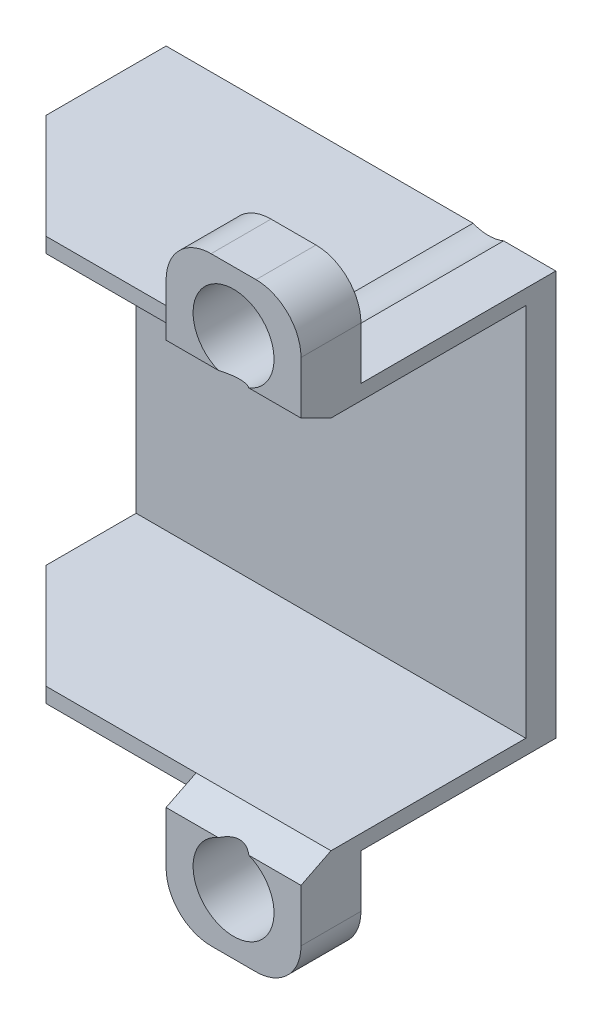
ISO-10303-21;
HEADER;
FILE_DESCRIPTION(('STEP AP214'),'2;1');
FILE_NAME('part.step','',(''),(''),'','','');
FILE_SCHEMA(('AUTOMOTIVE_DESIGN { 1 0 10303 214 1 1 1 1 }'));
ENDSEC;
DATA;
#1=APPLICATION_CONTEXT('core data for automotive mechanical design processes');
#2=APPLICATION_PROTOCOL_DEFINITION('international standard','automotive_design',2000,#1);
#3=PRODUCT_CONTEXT('',#1,'mechanical');
#4=PRODUCT('Part','Part','',(#3));
#5=PRODUCT_RELATED_PRODUCT_CATEGORY('part','',(#4));
#6=PRODUCT_DEFINITION_FORMATION('','',#4);
#7=PRODUCT_DEFINITION_CONTEXT('part definition',#1,'design');
#8=PRODUCT_DEFINITION('design','',#6,#7);
#9=PRODUCT_DEFINITION_SHAPE('','',#8);
#10=(LENGTH_UNIT() NAMED_UNIT(*) SI_UNIT(.MILLI.,.METRE.));
#11=(NAMED_UNIT(*) PLANE_ANGLE_UNIT() SI_UNIT($,.RADIAN.));
#12=(NAMED_UNIT(*) SI_UNIT($,.STERADIAN.) SOLID_ANGLE_UNIT());
#13=UNCERTAINTY_MEASURE_WITH_UNIT(LENGTH_MEASURE(1.E-05),#10,'distance_accuracy_value','');
#14=(GEOMETRIC_REPRESENTATION_CONTEXT(3) GLOBAL_UNCERTAINTY_ASSIGNED_CONTEXT((#13)) GLOBAL_UNIT_ASSIGNED_CONTEXT((#10,
#11,#12)) REPRESENTATION_CONTEXT('',''));
#15=CARTESIAN_POINT('',(0.,0.,0.));
#16=DIRECTION('',(0.,0.,1.));
#17=DIRECTION('',(1.,0.,0.));
#18=AXIS2_PLACEMENT_3D('',#15,#16,#17);
#19=CARTESIAN_POINT('',(-39.39977171448,-16.3800685313799,2.));
#20=DIRECTION('',(0.,1.,0.));
#21=DIRECTION('',(0.,0.,1.));
#22=AXIS2_PLACEMENT_3D('',#19,#20,#21);
#23=PLANE('',#22);
#24=DIRECTION('',(1.,0.,0.));
#25=VECTOR('',#24,1.);
#26=CARTESIAN_POINT('',(-39.39977171448,-16.3800685313799,15.));
#27=LINE('',#26,#25);
#28=CARTESIAN_POINT('',(-32.39977171448,-16.3800685313799,15.));
#29=VERTEX_POINT('',#28);
#30=CARTESIAN_POINT('',(-22.39977171448,-16.3800685313799,15.));
#31=VERTEX_POINT('',#30);
#32=EDGE_CURVE('E358',#29,#31,#27,.T.);
#33=ORIENTED_EDGE('',*,*,#32,.F.);
#34=DIRECTION('',(0.707106781186547,0.,0.707106781186547));
#35=VECTOR('',#34,1.);
#36=CARTESIAN_POINT('',(-39.39977171448,-16.3800685313799,8.));
#37=LINE('',#36,#35);
#38=CARTESIAN_POINT('',(-39.39977171448,-16.3800685313799,8.));
#39=VERTEX_POINT('',#38);
#40=EDGE_CURVE('E231',#39,#29,#37,.T.);
#41=ORIENTED_EDGE('',*,*,#40,.F.);
#42=DIRECTION('',(0.,0.,-1.));
#43=VECTOR('',#42,1.);
#44=CARTESIAN_POINT('',(-39.39977171448,-16.3800685313799,2.));
#45=LINE('',#44,#43);
#46=CARTESIAN_POINT('',(-39.39977171448,-16.3800685313799,0.));
#47=VERTEX_POINT('',#46);
#48=EDGE_CURVE('E261',#39,#47,#45,.T.);
#49=ORIENTED_EDGE('',*,*,#48,.T.);
#50=DIRECTION('',(1.,0.,0.));
#51=VECTOR('',#50,1.);
#52=CARTESIAN_POINT('',(-39.39977171448,-16.3800685313799,0.));
#53=LINE('',#52,#51);
#54=CARTESIAN_POINT('',(-18.9195756171986,-16.3800685313799,0.));
#55=VERTEX_POINT('',#54);
#56=EDGE_CURVE('E386',#47,#55,#53,.T.);
#57=ORIENTED_EDGE('',*,*,#56,.T.);
#58=DIRECTION('',(0.,0.,1.));
#59=VECTOR('',#58,1.);
#60=CARTESIAN_POINT('',(-18.9195756171986,-16.3800685313799,0.));
#61=LINE('',#60,#59);
#62=CARTESIAN_POINT('',(-18.9195756171986,-16.3800685313799,13.));
#63=VERTEX_POINT('',#62);
#64=EDGE_CURVE('E424',#55,#63,#61,.T.);
#65=ORIENTED_EDGE('',*,*,#64,.T.);
#66=DIRECTION('',(1.,0.,0.));
#67=VECTOR('',#66,1.);
#68=CARTESIAN_POINT('',(-22.39977171448,-16.3800685313799,13.));
#69=LINE('',#68,#67);
#70=CARTESIAN_POINT('',(-22.39977171448,-16.3800685313799,13.));
#71=VERTEX_POINT('',#70);
#72=EDGE_CURVE('E351',#71,#63,#69,.T.);
#73=ORIENTED_EDGE('',*,*,#72,.F.);
#74=DIRECTION('',(0.,0.,1.));
#75=VECTOR('',#74,1.);
#76=CARTESIAN_POINT('',(-22.39977171448,-16.3800685313799,15.));
#77=LINE('',#76,#75);
#78=EDGE_CURVE('E333',#71,#31,#77,.T.);
#79=ORIENTED_EDGE('',*,*,#78,.T.);
#80=EDGE_LOOP('',(#33,#41,#49,#57,#65,#73,#79));
#81=FACE_BOUND('',#80,.T.);
#82=ADVANCED_FACE('F33',(#81),#23,.F.);
#83=CARTESIAN_POINT('',(-39.39977171448,10.6199314686201,2.));
#84=DIRECTION('',(0.,-1.,0.));
#85=DIRECTION('',(0.,0.,-1.));
#86=AXIS2_PLACEMENT_3D('',#83,#84,#85);
#87=PLANE('',#86);
#88=DIRECTION('',(-1.,0.,0.));
#89=VECTOR('',#88,1.);
#90=CARTESIAN_POINT('',(-39.39977171448,10.6199314686201,0.));
#91=LINE('',#90,#89);
#92=CARTESIAN_POINT('',(-13.39977171448,10.6199314686201,0.));
#93=VERTEX_POINT('',#92);
#94=CARTESIAN_POINT('',(-16.8799678117614,10.6199314686201,0.));
#95=VERTEX_POINT('',#94);
#96=EDGE_CURVE('E256',#93,#95,#91,.T.);
#97=ORIENTED_EDGE('',*,*,#96,.T.);
#98=DIRECTION('',(0.,0.,1.));
#99=VECTOR('',#98,1.);
#100=CARTESIAN_POINT('',(-16.8799678117614,10.6199314686201,0.));
#101=LINE('',#100,#99);
#102=CARTESIAN_POINT('',(-16.8799678117614,10.6199314686201,13.));
#103=VERTEX_POINT('',#102);
#104=EDGE_CURVE('E398',#95,#103,#101,.T.);
#105=ORIENTED_EDGE('',*,*,#104,.T.);
#106=DIRECTION('',(1.,0.,0.));
#107=VECTOR('',#106,1.);
#108=CARTESIAN_POINT('',(-22.39977171448,10.6199314686201,13.));
#109=LINE('',#108,#107);
#110=CARTESIAN_POINT('',(-13.39977171448,10.6199314686201,13.));
#111=VERTEX_POINT('',#110);
#112=EDGE_CURVE('E441',#103,#111,#109,.T.);
#113=ORIENTED_EDGE('',*,*,#112,.T.);
#114=DIRECTION('',(0.,0.,-1.));
#115=VECTOR('',#114,1.);
#116=CARTESIAN_POINT('',(-13.39977171448,10.6199314686201,2.));
#117=LINE('',#116,#115);
#118=EDGE_CURVE('E248',#111,#93,#117,.T.);
#119=ORIENTED_EDGE('',*,*,#118,.T.);
#120=EDGE_LOOP('',(#97,#105,#113,#119));
#121=FACE_BOUND('',#120,.T.);
#122=ADVANCED_FACE('F397',(#121),#87,.F.);
#123=CARTESIAN_POINT('',(0.,0.,15.));
#124=DIRECTION('',(0.,0.,-1.));
#125=DIRECTION('',(-1.,0.,0.));
#126=AXIS2_PLACEMENT_3D('',#123,#124,#125);
#127=PLANE('',#126);
#128=DIRECTION('',(-1.,0.,0.));
#129=VECTOR('',#128,1.);
#130=CARTESIAN_POINT('',(-39.39977171448,-15.3800685313799,15.));
#131=LINE('',#130,#129);
#132=CARTESIAN_POINT('',(-22.39977171448,-15.3800685313799,15.));
#133=VERTEX_POINT('',#132);
#134=CARTESIAN_POINT('',(-32.39977171448,-15.3800685313799,15.));
#135=VERTEX_POINT('',#134);
#136=EDGE_CURVE('E360',#133,#135,#131,.T.);
#137=ORIENTED_EDGE('',*,*,#136,.T.);
#138=DIRECTION('',(0.,-1.,0.));
#139=VECTOR('',#138,1.);
#140=CARTESIAN_POINT('',(-32.39977171448,10.6199314686201,15.));
#141=LINE('',#140,#139);
#142=EDGE_CURVE('E56',#135,#29,#141,.T.);
#143=ORIENTED_EDGE('',*,*,#142,.T.);
#144=ORIENTED_EDGE('',*,*,#32,.T.);
#145=DIRECTION('',(0.,1.,0.));
#146=VECTOR('',#145,1.);
#147=CARTESIAN_POINT('',(-22.39977171448,-15.3800685313799,15.));
#148=LINE('',#147,#146);
#149=EDGE_CURVE('E350',#31,#133,#148,.T.);
#150=ORIENTED_EDGE('',*,*,#149,.T.);
#151=EDGE_LOOP('',(#137,#143,#144,#150));
#152=FACE_BOUND('',#151,.T.);
#153=ADVANCED_FACE('F472',(#152),#127,.F.);
#154=CARTESIAN_POINT('',(0.,0.,2.));
#155=DIRECTION('',(0.,0.,1.));
#156=DIRECTION('',(1.,0.,0.));
#157=AXIS2_PLACEMENT_3D('',#154,#155,#156);
#158=PLANE('',#157);
#159=DIRECTION('',(0.,-1.,0.));
#160=VECTOR('',#159,1.);
#161=CARTESIAN_POINT('',(-39.39977171448,10.6199314686201,2.));
#162=LINE('',#161,#160);
#163=CARTESIAN_POINT('',(-39.39977171448,9.61993146862011,2.));
#164=VERTEX_POINT('',#163);
#165=CARTESIAN_POINT('',(-39.39977171448,-15.3800685313799,2.));
#166=VERTEX_POINT('',#165);
#167=EDGE_CURVE('E253',#164,#166,#162,.T.);
#168=ORIENTED_EDGE('',*,*,#167,.T.);
#169=DIRECTION('',(-1.,0.,0.));
#170=VECTOR('',#169,1.);
#171=CARTESIAN_POINT('',(-39.39977171448,-15.3800685313799,2.));
#172=LINE('',#171,#170);
#173=CARTESIAN_POINT('',(-13.39977171448,-15.3800685313799,2.));
#174=VERTEX_POINT('',#173);
#175=EDGE_CURVE('E353',#174,#166,#172,.T.);
#176=ORIENTED_EDGE('',*,*,#175,.F.);
#177=DIRECTION('',(0.,1.,0.));
#178=VECTOR('',#177,1.);
#179=CARTESIAN_POINT('',(-13.39977171448,10.6199314686201,2.));
#180=LINE('',#179,#178);
#181=CARTESIAN_POINT('',(-13.39977171448,9.61993146862011,2.));
#182=VERTEX_POINT('',#181);
#183=EDGE_CURVE('E249',#174,#182,#180,.T.);
#184=ORIENTED_EDGE('',*,*,#183,.T.);
#185=DIRECTION('',(1.,0.,0.));
#186=VECTOR('',#185,1.);
#187=CARTESIAN_POINT('',(-39.39977171448,9.61993146862011,2.));
#188=LINE('',#187,#186);
#189=EDGE_CURVE('E370',#164,#182,#188,.T.);
#190=ORIENTED_EDGE('',*,*,#189,.F.);
#191=EDGE_LOOP('',(#168,#176,#184,#190));
#192=FACE_BOUND('',#191,.T.);
#193=ADVANCED_FACE('F535',(#192),#158,.T.);
#194=CARTESIAN_POINT('',(-39.39977171448,10.6199314686201,2.));
#195=DIRECTION('',(1.,0.,0.));
#196=DIRECTION('',(0.,0.,-1.));
#197=AXIS2_PLACEMENT_3D('',#194,#195,#196);
#198=PLANE('',#197);
#199=ORIENTED_EDGE('',*,*,#48,.F.);
#200=DIRECTION('',(0.,-1.,0.));
#201=VECTOR('',#200,1.);
#202=CARTESIAN_POINT('',(-39.39977171448,10.6199314686201,8.));
#203=LINE('',#202,#201);
#204=CARTESIAN_POINT('',(-39.39977171448,-15.3800685313799,8.));
#205=VERTEX_POINT('',#204);
#206=EDGE_CURVE('E230',#205,#39,#203,.T.);
#207=ORIENTED_EDGE('',*,*,#206,.F.);
#208=DIRECTION('',(0.,0.,-1.));
#209=VECTOR('',#208,1.);
#210=CARTESIAN_POINT('',(-39.39977171448,-15.3800685313799,15.));
#211=LINE('',#210,#209);
#212=EDGE_CURVE('E364',#205,#166,#211,.T.);
#213=ORIENTED_EDGE('',*,*,#212,.T.);
#214=ORIENTED_EDGE('',*,*,#167,.F.);
#215=DIRECTION('',(0.,0.,-1.));
#216=VECTOR('',#215,1.);
#217=CARTESIAN_POINT('',(-39.39977171448,9.61993146862011,15.));
#218=LINE('',#217,#216);
#219=CARTESIAN_POINT('',(-39.39977171448,9.61993146862011,8.));
#220=VERTEX_POINT('',#219);
#221=EDGE_CURVE('E241',#220,#164,#218,.T.);
#222=ORIENTED_EDGE('',*,*,#221,.F.);
#223=CARTESIAN_POINT('',(-39.39977171448,10.6199314686201,8.));
#224=VERTEX_POINT('',#223);
#225=EDGE_CURVE('E224',#224,#220,#203,.T.);
#226=ORIENTED_EDGE('',*,*,#225,.F.);
#227=DIRECTION('',(0.,0.,-1.));
#228=VECTOR('',#227,1.);
#229=CARTESIAN_POINT('',(-39.39977171448,10.6199314686201,2.));
#230=LINE('',#229,#228);
#231=CARTESIAN_POINT('',(-39.39977171448,10.6199314686201,0.));
#232=VERTEX_POINT('',#231);
#233=EDGE_CURVE('E238',#224,#232,#230,.T.);
#234=ORIENTED_EDGE('',*,*,#233,.T.);
#235=DIRECTION('',(0.,-1.,0.));
#236=VECTOR('',#235,1.);
#237=CARTESIAN_POINT('',(-39.39977171448,10.6199314686201,0.));
#238=LINE('',#237,#236);
#239=EDGE_CURVE('E381',#232,#47,#238,.T.);
#240=ORIENTED_EDGE('',*,*,#239,.T.);
#241=EDGE_LOOP('',(#199,#207,#213,#214,#222,#226,#234,#240));
#242=FACE_BOUND('',#241,.T.);
#243=ADVANCED_FACE('F236',(#242),#198,.F.);
#244=CARTESIAN_POINT('',(-16.8799678117614,-16.3800685313799,13.));
#245=VERTEX_POINT('',#244);
#246=CARTESIAN_POINT('',(-13.39977171448,-16.3800685313799,13.));
#247=VERTEX_POINT('',#246);
#248=EDGE_CURVE('E354',#245,#247,#69,.T.);
#249=ORIENTED_EDGE('',*,*,#248,.F.);
#250=DIRECTION('',(0.,0.,1.));
#251=VECTOR('',#250,1.);
#252=CARTESIAN_POINT('',(-16.8799678117615,-16.3800685313799,0.));
#253=LINE('',#252,#251);
#254=CARTESIAN_POINT('',(-16.8799678117615,-16.3800685313799,0.));
#255=VERTEX_POINT('',#254);
#256=EDGE_CURVE('E421',#245,#255,#253,.F.);
#257=ORIENTED_EDGE('',*,*,#256,.T.);
#258=CARTESIAN_POINT('',(-13.39977171448,-16.3800685313799,0.));
#259=VERTEX_POINT('',#258);
#260=EDGE_CURVE('E385',#255,#259,#53,.T.);
#261=ORIENTED_EDGE('',*,*,#260,.T.);
#262=DIRECTION('',(0.,0.,-1.));
#263=VECTOR('',#262,1.);
#264=CARTESIAN_POINT('',(-13.39977171448,-16.3800685313799,2.));
#265=LINE('',#264,#263);
#266=EDGE_CURVE('E251',#247,#259,#265,.T.);
#267=ORIENTED_EDGE('',*,*,#266,.F.);
#268=EDGE_LOOP('',(#249,#257,#261,#267));
#269=FACE_BOUND('',#268,.T.);
#270=ADVANCED_FACE('F542',(#269),#23,.F.);
#271=CARTESIAN_POINT('',(-13.39977171448,10.6199314686201,2.));
#272=DIRECTION('',(-1.,0.,0.));
#273=DIRECTION('',(0.,-1.,0.));
#274=AXIS2_PLACEMENT_3D('',#271,#272,#273);
#275=PLANE('',#274);
#276=DIRECTION('',(0.,1.,0.));
#277=VECTOR('',#276,1.);
#278=CARTESIAN_POINT('',(-13.39977171448,10.6199314686201,13.));
#279=LINE('',#278,#277);
#280=CARTESIAN_POINT('',(-13.39977171448,14.1199314686201,13.));
#281=VERTEX_POINT('',#280);
#282=EDGE_CURVE('E427',#111,#281,#279,.T.);
#283=ORIENTED_EDGE('',*,*,#282,.T.);
#284=DIRECTION('',(0.,0.,1.));
#285=VECTOR('',#284,1.);
#286=CARTESIAN_POINT('',(-13.39977171448,14.1199314686201,17.));
#287=LINE('',#286,#285);
#288=CARTESIAN_POINT('',(-13.39977171448,14.1199314686201,17.));
#289=VERTEX_POINT('',#288);
#290=EDGE_CURVE('E285',#281,#289,#287,.T.);
#291=ORIENTED_EDGE('',*,*,#290,.T.);
#292=DIRECTION('',(0.,-1.,0.));
#293=VECTOR('',#292,1.);
#294=CARTESIAN_POINT('',(-13.39977171448,10.6199314686201,17.));
#295=LINE('',#294,#293);
#296=CARTESIAN_POINT('',(-13.39977171448,10.6199314686201,17.));
#297=VERTEX_POINT('',#296);
#298=EDGE_CURVE('E444',#289,#297,#295,.T.);
#299=ORIENTED_EDGE('',*,*,#298,.T.);
#300=DIRECTION('',(0.,-0.447213595499958,-0.894427190999916));
#301=VECTOR('',#300,1.);
#302=CARTESIAN_POINT('',(-13.39977171448,10.6199314686201,17.));
#303=LINE('',#302,#301);
#304=CARTESIAN_POINT('',(-13.39977171448,9.61993146862011,15.));
#305=VERTEX_POINT('',#304);
#306=EDGE_CURVE('E431',#297,#305,#303,.T.);
#307=ORIENTED_EDGE('',*,*,#306,.T.);
#308=DIRECTION('',(0.,0.,-1.));
#309=VECTOR('',#308,1.);
#310=CARTESIAN_POINT('',(-13.39977171448,9.61993146862011,15.));
#311=LINE('',#310,#309);
#312=EDGE_CURVE('E375',#305,#182,#311,.T.);
#313=ORIENTED_EDGE('',*,*,#312,.T.);
#314=ORIENTED_EDGE('',*,*,#183,.F.);
#315=DIRECTION('',(0.,0.,-1.));
#316=VECTOR('',#315,1.);
#317=CARTESIAN_POINT('',(-13.39977171448,-15.3800685313799,15.));
#318=LINE('',#317,#316);
#319=CARTESIAN_POINT('',(-13.39977171448,-15.3800685313799,15.));
#320=VERTEX_POINT('',#319);
#321=EDGE_CURVE('E368',#320,#174,#318,.T.);
#322=ORIENTED_EDGE('',*,*,#321,.F.);
#323=DIRECTION('',(0.,-0.447213595499959,0.894427190999916));
#324=VECTOR('',#323,1.);
#325=CARTESIAN_POINT('',(-13.39977171448,-16.3800685313799,17.));
#326=LINE('',#325,#324);
#327=CARTESIAN_POINT('',(-13.39977171448,-16.3800685313799,17.));
#328=VERTEX_POINT('',#327);
#329=EDGE_CURVE('E341',#320,#328,#326,.T.);
#330=ORIENTED_EDGE('',*,*,#329,.T.);
#331=DIRECTION('',(0.,-1.,0.));
#332=VECTOR('',#331,1.);
#333=CARTESIAN_POINT('',(-13.39977171448,-16.3800685313799,17.));
#334=LINE('',#333,#332);
#335=CARTESIAN_POINT('',(-13.39977171448,-19.8800685313799,17.));
#336=VERTEX_POINT('',#335);
#337=EDGE_CURVE('E344',#328,#336,#334,.T.);
#338=ORIENTED_EDGE('',*,*,#337,.T.);
#339=DIRECTION('',(0.,0.,-1.));
#340=VECTOR('',#339,1.);
#341=CARTESIAN_POINT('',(-13.39977171448,-19.8800685313799,13.));
#342=LINE('',#341,#340);
#343=CARTESIAN_POINT('',(-13.39977171448,-19.8800685313799,13.));
#344=VERTEX_POINT('',#343);
#345=EDGE_CURVE('E282',#336,#344,#342,.T.);
#346=ORIENTED_EDGE('',*,*,#345,.T.);
#347=DIRECTION('',(0.,1.,0.));
#348=VECTOR('',#347,1.);
#349=CARTESIAN_POINT('',(-13.39977171448,-16.3800685313799,13.));
#350=LINE('',#349,#348);
#351=EDGE_CURVE('E348',#344,#247,#350,.T.);
#352=ORIENTED_EDGE('',*,*,#351,.T.);
#353=ORIENTED_EDGE('',*,*,#266,.T.);
#354=DIRECTION('',(0.,1.,0.));
#355=VECTOR('',#354,1.);
#356=CARTESIAN_POINT('',(-13.39977171448,10.6199314686201,0.));
#357=LINE('',#356,#355);
#358=EDGE_CURVE('E388',#259,#93,#357,.T.);
#359=ORIENTED_EDGE('',*,*,#358,.T.);
#360=ORIENTED_EDGE('',*,*,#118,.F.);
#361=EDGE_LOOP('',(#283,#291,#299,#307,#313,#314,#322,#330,#338,#346,#352,#353,#359,#360));
#362=FACE_BOUND('',#361,.T.);
#363=ADVANCED_FACE('F529',(#362),#275,.F.);
#364=ORIENTED_EDGE('',*,*,#233,.F.);
#365=DIRECTION('',(0.707106781186547,0.,0.707106781186547));
#366=VECTOR('',#365,1.);
#367=CARTESIAN_POINT('',(-39.39977171448,10.6199314686201,8.));
#368=LINE('',#367,#366);
#369=CARTESIAN_POINT('',(-32.39977171448,10.6199314686201,15.));
#370=VERTEX_POINT('',#369);
#371=EDGE_CURVE('E221',#224,#370,#368,.T.);
#372=ORIENTED_EDGE('',*,*,#371,.T.);
#373=DIRECTION('',(-1.,0.,0.));
#374=VECTOR('',#373,1.);
#375=CARTESIAN_POINT('',(-39.39977171448,10.6199314686201,15.));
#376=LINE('',#375,#374);
#377=CARTESIAN_POINT('',(-22.39977171448,10.6199314686201,15.));
#378=VERTEX_POINT('',#377);
#379=EDGE_CURVE('E373',#378,#370,#376,.T.);
#380=ORIENTED_EDGE('',*,*,#379,.F.);
#381=DIRECTION('',(0.,0.,-1.));
#382=VECTOR('',#381,1.);
#383=CARTESIAN_POINT('',(-22.39977171448,10.6199314686201,15.));
#384=LINE('',#383,#382);
#385=CARTESIAN_POINT('',(-22.39977171448,10.6199314686201,13.));
#386=VERTEX_POINT('',#385);
#387=EDGE_CURVE('E430',#378,#386,#384,.T.);
#388=ORIENTED_EDGE('',*,*,#387,.T.);
#389=CARTESIAN_POINT('',(-18.9195756171986,10.6199314686201,13.));
#390=VERTEX_POINT('',#389);
#391=EDGE_CURVE('E460',#386,#390,#109,.T.);
#392=ORIENTED_EDGE('',*,*,#391,.T.);
#393=DIRECTION('',(0.,0.,1.));
#394=VECTOR('',#393,1.);
#395=CARTESIAN_POINT('',(-18.9195756171986,10.6199314686201,0.));
#396=LINE('',#395,#394);
#397=CARTESIAN_POINT('',(-18.9195756171986,10.6199314686201,0.));
#398=VERTEX_POINT('',#397);
#399=EDGE_CURVE('E414',#390,#398,#396,.F.);
#400=ORIENTED_EDGE('',*,*,#399,.T.);
#401=EDGE_CURVE('E246',#398,#232,#91,.T.);
#402=ORIENTED_EDGE('',*,*,#401,.T.);
#403=EDGE_LOOP('',(#364,#372,#380,#388,#392,#400,#402));
#404=FACE_BOUND('',#403,.T.);
#405=ADVANCED_FACE('F243',(#404),#87,.F.);
#406=CARTESIAN_POINT('',(0.,0.,0.));
#407=DIRECTION('',(0.,0.,1.));
#408=DIRECTION('',(1.,0.,0.));
#409=AXIS2_PLACEMENT_3D('',#406,#407,#408);
#410=PLANE('',#409);
#411=ORIENTED_EDGE('',*,*,#260,.F.);
#412=CARTESIAN_POINT('',(-17.89977171448,-18.8800685313799,0.));
#413=DIRECTION('',(0.,0.,1.));
#414=DIRECTION('',(1.,0.,0.));
#415=AXIS2_PLACEMENT_3D('',#412,#413,#414);
#416=CIRCLE('',#415,2.7);
#417=EDGE_CURVE('E409',#255,#55,#416,.T.);
#418=ORIENTED_EDGE('',*,*,#417,.T.);
#419=ORIENTED_EDGE('',*,*,#56,.F.);
#420=ORIENTED_EDGE('',*,*,#239,.F.);
#421=ORIENTED_EDGE('',*,*,#401,.F.);
#422=CARTESIAN_POINT('',(-17.89977171448,13.1199314686201,0.));
#423=DIRECTION('',(0.,0.,1.));
#424=DIRECTION('',(1.,0.,0.));
#425=AXIS2_PLACEMENT_3D('',#422,#423,#424);
#426=CIRCLE('',#425,2.7);
#427=EDGE_CURVE('E404',#398,#95,#426,.T.);
#428=ORIENTED_EDGE('',*,*,#427,.T.);
#429=ORIENTED_EDGE('',*,*,#96,.F.);
#430=ORIENTED_EDGE('',*,*,#358,.F.);
#431=EDGE_LOOP('',(#411,#418,#419,#420,#421,#428,#429,#430));
#432=FACE_BOUND('',#431,.T.);
#433=ADVANCED_FACE('F403',(#432),#410,.F.);
#434=CARTESIAN_POINT('',(-39.39977171448,9.61993146862011,15.));
#435=DIRECTION('',(0.,1.,0.));
#436=DIRECTION('',(0.,0.,1.));
#437=AXIS2_PLACEMENT_3D('',#434,#435,#436);
#438=PLANE('',#437);
#439=DIRECTION('',(1.,0.,0.));
#440=VECTOR('',#439,1.);
#441=CARTESIAN_POINT('',(-39.39977171448,9.61993146862011,15.));
#442=LINE('',#441,#440);
#443=CARTESIAN_POINT('',(-32.39977171448,9.61993146862011,15.));
#444=VERTEX_POINT('',#443);
#445=CARTESIAN_POINT('',(-22.39977171448,9.61993146862011,15.));
#446=VERTEX_POINT('',#445);
#447=EDGE_CURVE('E371',#444,#446,#442,.T.);
#448=ORIENTED_EDGE('',*,*,#447,.F.);
#449=DIRECTION('',(-0.707106781186548,0.,-0.707106781186548));
#450=VECTOR('',#449,1.);
#451=CARTESIAN_POINT('',(-35.89977171448,9.61993146862011,11.5));
#452=LINE('',#451,#450);
#453=EDGE_CURVE('E48',#444,#220,#452,.T.);
#454=ORIENTED_EDGE('',*,*,#453,.T.);
#455=ORIENTED_EDGE('',*,*,#221,.T.);
#456=ORIENTED_EDGE('',*,*,#189,.T.);
#457=ORIENTED_EDGE('',*,*,#312,.F.);
#458=DIRECTION('',(1.,0.,0.));
#459=VECTOR('',#458,1.);
#460=CARTESIAN_POINT('',(-22.39977171448,9.61993146862011,15.));
#461=LINE('',#460,#459);
#462=EDGE_CURVE('E345',#446,#305,#461,.T.);
#463=ORIENTED_EDGE('',*,*,#462,.F.);
#464=EDGE_LOOP('',(#448,#454,#455,#456,#457,#463));
#465=FACE_BOUND('',#464,.T.);
#466=ADVANCED_FACE('F493',(#465),#438,.F.);
#467=CARTESIAN_POINT('',(0.,0.,15.));
#468=DIRECTION('',(0.,0.,1.));
#469=DIRECTION('',(1.,0.,0.));
#470=AXIS2_PLACEMENT_3D('',#467,#468,#469);
#471=PLANE('',#470);
#472=EDGE_CURVE('E225',#370,#444,#141,.T.);
#473=ORIENTED_EDGE('',*,*,#472,.T.);
#474=ORIENTED_EDGE('',*,*,#447,.T.);
#475=DIRECTION('',(0.,1.,0.));
#476=VECTOR('',#475,1.);
#477=CARTESIAN_POINT('',(-22.39977171448,9.61993146862011,15.));
#478=LINE('',#477,#476);
#479=EDGE_CURVE('E428',#446,#378,#478,.T.);
#480=ORIENTED_EDGE('',*,*,#479,.T.);
#481=ORIENTED_EDGE('',*,*,#379,.T.);
#482=EDGE_LOOP('',(#473,#474,#480,#481));
#483=FACE_BOUND('',#482,.T.);
#484=ADVANCED_FACE('F490',(#483),#471,.T.);
#485=CARTESIAN_POINT('',(-39.39977171448,-15.3800685313799,15.));
#486=DIRECTION('',(0.,-1.,0.));
#487=DIRECTION('',(0.,0.,-1.));
#488=AXIS2_PLACEMENT_3D('',#485,#486,#487);
#489=PLANE('',#488);
#490=ORIENTED_EDGE('',*,*,#212,.F.);
#491=DIRECTION('',(0.707106781186548,0.,0.707106781186548));
#492=VECTOR('',#491,1.);
#493=CARTESIAN_POINT('',(-35.89977171448,-15.3800685313799,11.5));
#494=LINE('',#493,#492);
#495=EDGE_CURVE('E11',#205,#135,#494,.T.);
#496=ORIENTED_EDGE('',*,*,#495,.T.);
#497=ORIENTED_EDGE('',*,*,#136,.F.);
#498=EDGE_CURVE('E361',#320,#133,#131,.T.);
#499=ORIENTED_EDGE('',*,*,#498,.F.);
#500=ORIENTED_EDGE('',*,*,#321,.T.);
#501=ORIENTED_EDGE('',*,*,#175,.T.);
#502=EDGE_LOOP('',(#490,#496,#497,#499,#500,#501));
#503=FACE_BOUND('',#502,.T.);
#504=ADVANCED_FACE('F476',(#503),#489,.F.);
#505=CARTESIAN_POINT('',(-22.39977171448,-16.3800685313799,13.));
#506=DIRECTION('',(0.,0.,-1.));
#507=DIRECTION('',(-1.,0.,0.));
#508=AXIS2_PLACEMENT_3D('',#505,#506,#507);
#509=PLANE('',#508);
#510=DIRECTION('',(1.,0.,0.));
#511=VECTOR('',#510,1.);
#512=CARTESIAN_POINT('',(-22.39977171448,-22.8800685313799,13.));
#513=LINE('',#512,#511);
#514=CARTESIAN_POINT('',(-19.39977171448,-22.8800685313799,13.));
#515=VERTEX_POINT('',#514);
#516=CARTESIAN_POINT('',(-16.39977171448,-22.8800685313799,13.));
#517=VERTEX_POINT('',#516);
#518=EDGE_CURVE('E318',#515,#517,#513,.T.);
#519=ORIENTED_EDGE('',*,*,#518,.F.);
#520=CARTESIAN_POINT('',(-19.39977171448,-19.8800685313799,13.));
#521=DIRECTION('',(0.,0.,-1.));
#522=DIRECTION('',(-1.,0.,0.));
#523=AXIS2_PLACEMENT_3D('',#520,#521,#522);
#524=CIRCLE('',#523,3.);
#525=CARTESIAN_POINT('',(-22.39977171448,-19.8800685313799,13.));
#526=VERTEX_POINT('',#525);
#527=EDGE_CURVE('E295',#515,#526,#524,.T.);
#528=ORIENTED_EDGE('',*,*,#527,.T.);
#529=DIRECTION('',(0.,1.,0.));
#530=VECTOR('',#529,1.);
#531=CARTESIAN_POINT('',(-22.39977171448,-16.3800685313799,13.));
#532=LINE('',#531,#530);
#533=EDGE_CURVE('E326',#526,#71,#532,.T.);
#534=ORIENTED_EDGE('',*,*,#533,.T.);
#535=ORIENTED_EDGE('',*,*,#72,.T.);
#536=CARTESIAN_POINT('',(-17.89977171448,-18.8800685313799,13.));
#537=DIRECTION('',(0.,0.,-1.));
#538=DIRECTION('',(-1.,0.,0.));
#539=AXIS2_PLACEMENT_3D('',#536,#537,#538);
#540=CIRCLE('',#539,2.7);
#541=EDGE_CURVE('E419',#245,#63,#540,.T.);
#542=ORIENTED_EDGE('',*,*,#541,.F.);
#543=ORIENTED_EDGE('',*,*,#248,.T.);
#544=ORIENTED_EDGE('',*,*,#351,.F.);
#545=CARTESIAN_POINT('',(-16.39977171448,-19.8800685313799,13.));
#546=DIRECTION('',(0.,0.,-1.));
#547=DIRECTION('',(-1.,0.,0.));
#548=AXIS2_PLACEMENT_3D('',#545,#546,#547);
#549=CIRCLE('',#548,3.);
#550=EDGE_CURVE('E293',#344,#517,#549,.T.);
#551=ORIENTED_EDGE('',*,*,#550,.T.);
#552=EDGE_LOOP('',(#519,#528,#534,#535,#542,#543,#544,#551));
#553=FACE_BOUND('',#552,.T.);
#554=ADVANCED_FACE('F324',(#553),#509,.T.);
#555=CARTESIAN_POINT('',(-22.39977171448,-22.8800685313799,15.));
#556=DIRECTION('',(0.,-1.,0.));
#557=DIRECTION('',(0.,0.,-1.));
#558=AXIS2_PLACEMENT_3D('',#555,#556,#557);
#559=PLANE('',#558);
#560=DIRECTION('',(1.,0.,0.));
#561=VECTOR('',#560,1.);
#562=CARTESIAN_POINT('',(-22.39977171448,-22.8800685313799,17.));
#563=LINE('',#562,#561);
#564=CARTESIAN_POINT('',(-19.39977171448,-22.8800685313799,17.));
#565=VERTEX_POINT('',#564);
#566=CARTESIAN_POINT('',(-16.39977171448,-22.8800685313799,17.));
#567=VERTEX_POINT('',#566);
#568=EDGE_CURVE('E306',#565,#567,#563,.T.);
#569=ORIENTED_EDGE('',*,*,#568,.F.);
#570=DIRECTION('',(0.,0.,-1.));
#571=VECTOR('',#570,1.);
#572=CARTESIAN_POINT('',(-19.39977171448,-22.8800685313799,13.));
#573=LINE('',#572,#571);
#574=EDGE_CURVE('E290',#565,#515,#573,.T.);
#575=ORIENTED_EDGE('',*,*,#574,.T.);
#576=ORIENTED_EDGE('',*,*,#518,.T.);
#577=DIRECTION('',(0.,0.,-1.));
#578=VECTOR('',#577,1.);
#579=CARTESIAN_POINT('',(-16.39977171448,-22.8800685313799,17.));
#580=LINE('',#579,#578);
#581=EDGE_CURVE('E288',#517,#567,#580,.F.);
#582=ORIENTED_EDGE('',*,*,#581,.T.);
#583=EDGE_LOOP('',(#569,#575,#576,#582));
#584=FACE_BOUND('',#583,.T.);
#585=ADVANCED_FACE('F314',(#584),#559,.T.);
#586=CARTESIAN_POINT('',(-22.39977171448,-16.3800685313799,17.));
#587=DIRECTION('',(0.,0.,1.));
#588=DIRECTION('',(1.,0.,0.));
#589=AXIS2_PLACEMENT_3D('',#586,#587,#588);
#590=PLANE('',#589);
#591=DIRECTION('',(0.,-1.,0.));
#592=VECTOR('',#591,1.);
#593=CARTESIAN_POINT('',(-22.39977171448,-16.3800685313799,17.));
#594=LINE('',#593,#592);
#595=CARTESIAN_POINT('',(-22.39977171448,-16.3800685313799,17.));
#596=VERTEX_POINT('',#595);
#597=CARTESIAN_POINT('',(-22.39977171448,-19.8800685313799,17.));
#598=VERTEX_POINT('',#597);
#599=EDGE_CURVE('E309',#596,#598,#594,.T.);
#600=ORIENTED_EDGE('',*,*,#599,.T.);
#601=CARTESIAN_POINT('',(-19.39977171448,-19.8800685313799,17.));
#602=DIRECTION('',(0.,0.,1.));
#603=DIRECTION('',(1.,0.,0.));
#604=AXIS2_PLACEMENT_3D('',#601,#602,#603);
#605=CIRCLE('',#604,3.);
#606=EDGE_CURVE('E41',#598,#565,#605,.T.);
#607=ORIENTED_EDGE('',*,*,#606,.T.);
#608=ORIENTED_EDGE('',*,*,#568,.T.);
#609=CARTESIAN_POINT('',(-16.39977171448,-19.8800685313799,17.));
#610=DIRECTION('',(0.,0.,1.));
#611=DIRECTION('',(1.,0.,0.));
#612=AXIS2_PLACEMENT_3D('',#609,#610,#611);
#613=CIRCLE('',#612,3.);
#614=EDGE_CURVE('E299',#567,#336,#613,.T.);
#615=ORIENTED_EDGE('',*,*,#614,.T.);
#616=ORIENTED_EDGE('',*,*,#337,.F.);
#617=DIRECTION('',(1.,0.,0.));
#618=VECTOR('',#617,1.);
#619=CARTESIAN_POINT('',(-22.39977171448,-16.3800685313799,17.));
#620=LINE('',#619,#618);
#621=CARTESIAN_POINT('',(-16.8799678117614,-16.3800685313799,17.));
#622=VERTEX_POINT('',#621);
#623=EDGE_CURVE('E335',#622,#328,#620,.T.);
#624=ORIENTED_EDGE('',*,*,#623,.F.);
#625=CARTESIAN_POINT('',(-17.89977171448,-18.8800685313799,17.));
#626=DIRECTION('',(0.,0.,1.));
#627=DIRECTION('',(1.,0.,0.));
#628=AXIS2_PLACEMENT_3D('',#625,#626,#627);
#629=CIRCLE('',#628,2.7);
#630=CARTESIAN_POINT('',(-18.9195756171986,-16.3800685313799,17.));
#631=VERTEX_POINT('',#630);
#632=EDGE_CURVE('E406',#631,#622,#629,.T.);
#633=ORIENTED_EDGE('',*,*,#632,.F.);
#634=EDGE_CURVE('E319',#596,#631,#620,.T.);
#635=ORIENTED_EDGE('',*,*,#634,.F.);
#636=EDGE_LOOP('',(#600,#607,#608,#615,#616,#624,#633,#635));
#637=FACE_BOUND('',#636,.T.);
#638=ADVANCED_FACE('F305',(#637),#590,.T.);
#639=CARTESIAN_POINT('',(-22.39977171448,-16.3800685313799,17.));
#640=DIRECTION('',(0.,0.894427190999916,0.447213595499958));
#641=DIRECTION('',(0.,-0.447213595499959,0.894427190999916));
#642=AXIS2_PLACEMENT_3D('',#639,#640,#641);
#643=PLANE('',#642);
#644=CARTESIAN_POINT('',(-17.89977171448,-18.8800685313799,22.));
#645=DIRECTION('',(0.,0.894427190999916,0.447213595499958));
#646=DIRECTION('',(0.,-0.447213595499959,0.894427190999916));
#647=AXIS2_PLACEMENT_3D('',#644,#645,#646);
#648=ELLIPSE('',#647,6.03738353924943,2.7);
#649=EDGE_CURVE('E265',#622,#631,#648,.T.);
#650=ORIENTED_EDGE('',*,*,#649,.F.);
#651=ORIENTED_EDGE('',*,*,#623,.T.);
#652=ORIENTED_EDGE('',*,*,#329,.F.);
#653=ORIENTED_EDGE('',*,*,#498,.T.);
#654=DIRECTION('',(0.,-0.447213595499959,0.894427190999916));
#655=VECTOR('',#654,1.);
#656=CARTESIAN_POINT('',(-22.39977171448,-16.3800685313799,17.));
#657=LINE('',#656,#655);
#658=EDGE_CURVE('E337',#133,#596,#657,.T.);
#659=ORIENTED_EDGE('',*,*,#658,.T.);
#660=ORIENTED_EDGE('',*,*,#634,.T.);
#661=EDGE_LOOP('',(#650,#651,#652,#653,#659,#660));
#662=FACE_BOUND('',#661,.T.);
#663=ADVANCED_FACE('F467',(#662),#643,.T.);
#664=CARTESIAN_POINT('',(-22.39977171448,0.,0.));
#665=DIRECTION('',(1.,0.,0.));
#666=DIRECTION('',(0.,0.,-1.));
#667=AXIS2_PLACEMENT_3D('',#664,#665,#666);
#668=PLANE('',#667);
#669=ORIENTED_EDGE('',*,*,#533,.F.);
#670=DIRECTION('',(0.,0.,-1.));
#671=VECTOR('',#670,1.);
#672=CARTESIAN_POINT('',(-22.39977171448,-19.8800685313799,17.));
#673=LINE('',#672,#671);
#674=EDGE_CURVE('E297',#526,#598,#673,.F.);
#675=ORIENTED_EDGE('',*,*,#674,.T.);
#676=ORIENTED_EDGE('',*,*,#599,.F.);
#677=ORIENTED_EDGE('',*,*,#658,.F.);
#678=ORIENTED_EDGE('',*,*,#149,.F.);
#679=ORIENTED_EDGE('',*,*,#78,.F.);
#680=EDGE_LOOP('',(#669,#675,#676,#677,#678,#679));
#681=FACE_BOUND('',#680,.T.);
#682=ADVANCED_FACE('F330',(#681),#668,.F.);
#683=CARTESIAN_POINT('',(-22.39977171448,10.6199314686201,17.));
#684=DIRECTION('',(0.,-0.894427190999916,0.447213595499958));
#685=DIRECTION('',(0.,-0.447213595499958,-0.894427190999916));
#686=AXIS2_PLACEMENT_3D('',#683,#684,#685);
#687=PLANE('',#686);
#688=CARTESIAN_POINT('',(-17.89977171448,13.1199314686201,22.));
#689=DIRECTION('',(0.,-0.894427190999916,0.447213595499958));
#690=DIRECTION('',(0.,0.447213595499958,0.894427190999916));
#691=AXIS2_PLACEMENT_3D('',#688,#689,#690);
#692=ELLIPSE('',#691,6.03738353924943,2.7);
#693=CARTESIAN_POINT('',(-18.9195756171986,10.6199314686201,17.));
#694=VERTEX_POINT('',#693);
#695=CARTESIAN_POINT('',(-16.8799678117614,10.6199314686201,17.));
#696=VERTEX_POINT('',#695);
#697=EDGE_CURVE('E417',#694,#696,#692,.T.);
#698=ORIENTED_EDGE('',*,*,#697,.F.);
#699=DIRECTION('',(1.,0.,0.));
#700=VECTOR('',#699,1.);
#701=CARTESIAN_POINT('',(-22.39977171448,10.6199314686201,17.));
#702=LINE('',#701,#700);
#703=CARTESIAN_POINT('',(-22.39977171448,10.6199314686201,17.));
#704=VERTEX_POINT('',#703);
#705=EDGE_CURVE('E450',#704,#694,#702,.T.);
#706=ORIENTED_EDGE('',*,*,#705,.F.);
#707=DIRECTION('',(0.,-0.447213595499958,-0.894427190999916));
#708=VECTOR('',#707,1.);
#709=CARTESIAN_POINT('',(-22.39977171448,10.6199314686201,17.));
#710=LINE('',#709,#708);
#711=EDGE_CURVE('E438',#704,#446,#710,.T.);
#712=ORIENTED_EDGE('',*,*,#711,.T.);
#713=ORIENTED_EDGE('',*,*,#462,.T.);
#714=ORIENTED_EDGE('',*,*,#306,.F.);
#715=EDGE_CURVE('E453',#696,#297,#702,.T.);
#716=ORIENTED_EDGE('',*,*,#715,.F.);
#717=EDGE_LOOP('',(#698,#706,#712,#713,#714,#716));
#718=FACE_BOUND('',#717,.T.);
#719=ADVANCED_FACE('F505',(#718),#687,.T.);
#720=CARTESIAN_POINT('',(-22.39977171448,10.6199314686201,17.));
#721=DIRECTION('',(0.,0.,1.));
#722=DIRECTION('',(0.,-1.,0.));
#723=AXIS2_PLACEMENT_3D('',#720,#721,#722);
#724=PLANE('',#723);
#725=DIRECTION('',(1.,0.,0.));
#726=VECTOR('',#725,1.);
#727=CARTESIAN_POINT('',(-22.39977171448,17.1199314686201,17.));
#728=LINE('',#727,#726);
#729=CARTESIAN_POINT('',(-19.39977171448,17.1199314686201,17.));
#730=VERTEX_POINT('',#729);
#731=CARTESIAN_POINT('',(-16.39977171448,17.1199314686201,17.));
#732=VERTEX_POINT('',#731);
#733=EDGE_CURVE('E454',#730,#732,#728,.T.);
#734=ORIENTED_EDGE('',*,*,#733,.F.);
#735=CARTESIAN_POINT('',(-19.39977171448,14.1199314686201,17.));
#736=DIRECTION('',(0.,0.,1.));
#737=DIRECTION('',(0.,-1.,0.));
#738=AXIS2_PLACEMENT_3D('',#735,#736,#737);
#739=CIRCLE('',#738,3.);
#740=CARTESIAN_POINT('',(-22.39977171448,14.1199314686201,17.));
#741=VERTEX_POINT('',#740);
#742=EDGE_CURVE('E274',#730,#741,#739,.T.);
#743=ORIENTED_EDGE('',*,*,#742,.T.);
#744=DIRECTION('',(0.,-1.,0.));
#745=VECTOR('',#744,1.);
#746=CARTESIAN_POINT('',(-22.39977171448,10.6199314686201,17.));
#747=LINE('',#746,#745);
#748=EDGE_CURVE('E436',#741,#704,#747,.T.);
#749=ORIENTED_EDGE('',*,*,#748,.T.);
#750=ORIENTED_EDGE('',*,*,#705,.T.);
#751=CARTESIAN_POINT('',(-17.89977171448,13.1199314686201,17.));
#752=DIRECTION('',(0.,0.,1.));
#753=DIRECTION('',(1.,0.,0.));
#754=AXIS2_PLACEMENT_3D('',#751,#752,#753);
#755=CIRCLE('',#754,2.7);
#756=EDGE_CURVE('E407',#696,#694,#755,.T.);
#757=ORIENTED_EDGE('',*,*,#756,.F.);
#758=ORIENTED_EDGE('',*,*,#715,.T.);
#759=ORIENTED_EDGE('',*,*,#298,.F.);
#760=CARTESIAN_POINT('',(-16.39977171448,14.1199314686201,17.));
#761=DIRECTION('',(0.,0.,1.));
#762=DIRECTION('',(0.,-1.,0.));
#763=AXIS2_PLACEMENT_3D('',#760,#761,#762);
#764=CIRCLE('',#763,3.);
#765=EDGE_CURVE('E272',#289,#732,#764,.T.);
#766=ORIENTED_EDGE('',*,*,#765,.T.);
#767=EDGE_LOOP('',(#734,#743,#749,#750,#757,#758,#759,#766));
#768=FACE_BOUND('',#767,.T.);
#769=ADVANCED_FACE('F510',(#768),#724,.T.);
#770=CARTESIAN_POINT('',(-22.39977171448,17.1199314686201,15.));
#771=DIRECTION('',(0.,1.,0.));
#772=DIRECTION('',(-1.,0.,0.));
#773=AXIS2_PLACEMENT_3D('',#770,#771,#772);
#774=PLANE('',#773);
#775=DIRECTION('',(1.,0.,0.));
#776=VECTOR('',#775,1.);
#777=CARTESIAN_POINT('',(-22.39977171448,17.1199314686201,13.));
#778=LINE('',#777,#776);
#779=CARTESIAN_POINT('',(-19.39977171448,17.1199314686201,13.));
#780=VERTEX_POINT('',#779);
#781=CARTESIAN_POINT('',(-16.39977171448,17.1199314686201,13.));
#782=VERTEX_POINT('',#781);
#783=EDGE_CURVE('E457',#780,#782,#778,.T.);
#784=ORIENTED_EDGE('',*,*,#783,.F.);
#785=DIRECTION('',(0.,0.,1.));
#786=VECTOR('',#785,1.);
#787=CARTESIAN_POINT('',(-19.39977171448,17.1199314686201,15.));
#788=LINE('',#787,#786);
#789=EDGE_CURVE('E269',#780,#730,#788,.T.);
#790=ORIENTED_EDGE('',*,*,#789,.T.);
#791=ORIENTED_EDGE('',*,*,#733,.T.);
#792=DIRECTION('',(0.,0.,1.));
#793=VECTOR('',#792,1.);
#794=CARTESIAN_POINT('',(-16.39977171448,17.1199314686201,13.));
#795=LINE('',#794,#793);
#796=EDGE_CURVE('E267',#732,#782,#795,.F.);
#797=ORIENTED_EDGE('',*,*,#796,.T.);
#798=EDGE_LOOP('',(#784,#790,#791,#797));
#799=FACE_BOUND('',#798,.T.);
#800=ADVANCED_FACE('F523',(#799),#774,.T.);
#801=CARTESIAN_POINT('',(-22.39977171448,10.6199314686201,13.));
#802=DIRECTION('',(0.,0.,-1.));
#803=DIRECTION('',(-1.,0.,0.));
#804=AXIS2_PLACEMENT_3D('',#801,#802,#803);
#805=PLANE('',#804);
#806=DIRECTION('',(0.,1.,0.));
#807=VECTOR('',#806,1.);
#808=CARTESIAN_POINT('',(-22.39977171448,10.6199314686201,13.));
#809=LINE('',#808,#807);
#810=CARTESIAN_POINT('',(-22.39977171448,14.1199314686201,13.));
#811=VERTEX_POINT('',#810);
#812=EDGE_CURVE('E433',#386,#811,#809,.T.);
#813=ORIENTED_EDGE('',*,*,#812,.T.);
#814=CARTESIAN_POINT('',(-19.39977171448,14.1199314686201,13.));
#815=DIRECTION('',(0.,0.,-1.));
#816=DIRECTION('',(-1.,0.,0.));
#817=AXIS2_PLACEMENT_3D('',#814,#815,#816);
#818=CIRCLE('',#817,3.);
#819=EDGE_CURVE('E280',#811,#780,#818,.T.);
#820=ORIENTED_EDGE('',*,*,#819,.T.);
#821=ORIENTED_EDGE('',*,*,#783,.T.);
#822=CARTESIAN_POINT('',(-16.39977171448,14.1199314686201,13.));
#823=DIRECTION('',(0.,0.,-1.));
#824=DIRECTION('',(-1.,0.,0.));
#825=AXIS2_PLACEMENT_3D('',#822,#823,#824);
#826=CIRCLE('',#825,3.);
#827=EDGE_CURVE('E278',#782,#281,#826,.T.);
#828=ORIENTED_EDGE('',*,*,#827,.T.);
#829=ORIENTED_EDGE('',*,*,#282,.F.);
#830=ORIENTED_EDGE('',*,*,#112,.F.);
#831=CARTESIAN_POINT('',(-17.89977171448,13.1199314686201,13.));
#832=DIRECTION('',(0.,0.,-1.));
#833=DIRECTION('',(-1.,0.,0.));
#834=AXIS2_PLACEMENT_3D('',#831,#832,#833);
#835=CIRCLE('',#834,2.7);
#836=EDGE_CURVE('E263',#390,#103,#835,.T.);
#837=ORIENTED_EDGE('',*,*,#836,.F.);
#838=ORIENTED_EDGE('',*,*,#391,.F.);
#839=EDGE_LOOP('',(#813,#820,#821,#828,#829,#830,#837,#838));
#840=FACE_BOUND('',#839,.T.);
#841=ADVANCED_FACE('F519',(#840),#805,.T.);
#842=CARTESIAN_POINT('',(-22.39977171448,0.,0.));
#843=DIRECTION('',(-1.,0.,0.));
#844=DIRECTION('',(0.,0.,1.));
#845=AXIS2_PLACEMENT_3D('',#842,#843,#844);
#846=PLANE('',#845);
#847=ORIENTED_EDGE('',*,*,#748,.F.);
#848=DIRECTION('',(0.,0.,1.));
#849=VECTOR('',#848,1.);
#850=CARTESIAN_POINT('',(-22.39977171448,14.1199314686201,0.));
#851=LINE('',#850,#849);
#852=EDGE_CURVE('E276',#741,#811,#851,.F.);
#853=ORIENTED_EDGE('',*,*,#852,.T.);
#854=ORIENTED_EDGE('',*,*,#812,.F.);
#855=ORIENTED_EDGE('',*,*,#387,.F.);
#856=ORIENTED_EDGE('',*,*,#479,.F.);
#857=ORIENTED_EDGE('',*,*,#711,.F.);
#858=EDGE_LOOP('',(#847,#853,#854,#855,#856,#857));
#859=FACE_BOUND('',#858,.T.);
#860=ADVANCED_FACE('F501',(#859),#846,.T.);
#861=CARTESIAN_POINT('',(-17.89977171448,13.1199314686201,0.));
#862=DIRECTION('',(0.,0.,1.));
#863=DIRECTION('',(1.,0.,0.));
#864=AXIS2_PLACEMENT_3D('',#861,#862,#863);
#865=CYLINDRICAL_SURFACE('',#864,2.7);
#866=ORIENTED_EDGE('',*,*,#697,.T.);
#867=ORIENTED_EDGE('',*,*,#756,.T.);
#868=EDGE_LOOP('',(#866,#867));
#869=FACE_BOUND('',#868,.T.);
#870=ORIENTED_EDGE('',*,*,#427,.F.);
#871=ORIENTED_EDGE('',*,*,#399,.F.);
#872=ORIENTED_EDGE('',*,*,#836,.T.);
#873=ORIENTED_EDGE('',*,*,#104,.F.);
#874=EDGE_LOOP('',(#870,#871,#872,#873));
#875=FACE_BOUND('',#874,.T.);
#876=ADVANCED_FACE('F566',(#869,#875),#865,.F.);
#877=CARTESIAN_POINT('',(-17.89977171448,-18.8800685313799,0.));
#878=DIRECTION('',(0.,0.,1.));
#879=DIRECTION('',(1.,0.,0.));
#880=AXIS2_PLACEMENT_3D('',#877,#878,#879);
#881=CYLINDRICAL_SURFACE('',#880,2.7);
#882=ORIENTED_EDGE('',*,*,#649,.T.);
#883=ORIENTED_EDGE('',*,*,#632,.T.);
#884=EDGE_LOOP('',(#882,#883));
#885=FACE_BOUND('',#884,.T.);
#886=ORIENTED_EDGE('',*,*,#417,.F.);
#887=ORIENTED_EDGE('',*,*,#256,.F.);
#888=ORIENTED_EDGE('',*,*,#541,.T.);
#889=ORIENTED_EDGE('',*,*,#64,.F.);
#890=EDGE_LOOP('',(#886,#887,#888,#889));
#891=FACE_BOUND('',#890,.T.);
#892=ADVANCED_FACE('F564',(#885,#891),#881,.F.);
#893=CARTESIAN_POINT('',(-19.39977171448,14.1199314686201,15.));
#894=DIRECTION('',(0.,0.,1.));
#895=DIRECTION('',(1.,0.,0.));
#896=AXIS2_PLACEMENT_3D('',#893,#894,#895);
#897=CYLINDRICAL_SURFACE('',#896,3.);
#898=ORIENTED_EDGE('',*,*,#819,.F.);
#899=ORIENTED_EDGE('',*,*,#852,.F.);
#900=ORIENTED_EDGE('',*,*,#742,.F.);
#901=ORIENTED_EDGE('',*,*,#789,.F.);
#902=EDGE_LOOP('',(#898,#899,#900,#901));
#903=FACE_BOUND('',#902,.T.);
#904=ADVANCED_FACE('F515',(#903),#897,.T.);
#905=CARTESIAN_POINT('',(-16.39977171448,14.1199314686201,2.));
#906=DIRECTION('',(0.,0.,-1.));
#907=DIRECTION('',(-1.,0.,0.));
#908=AXIS2_PLACEMENT_3D('',#905,#906,#907);
#909=CYLINDRICAL_SURFACE('',#908,3.);
#910=ORIENTED_EDGE('',*,*,#827,.F.);
#911=ORIENTED_EDGE('',*,*,#796,.F.);
#912=ORIENTED_EDGE('',*,*,#765,.F.);
#913=ORIENTED_EDGE('',*,*,#290,.F.);
#914=EDGE_LOOP('',(#910,#911,#912,#913));
#915=FACE_BOUND('',#914,.T.);
#916=ADVANCED_FACE('F526',(#915),#909,.T.);
#917=CARTESIAN_POINT('',(-19.39977171448,-19.8800685313799,15.));
#918=DIRECTION('',(0.,0.,1.));
#919=DIRECTION('',(0.,-1.,0.));
#920=AXIS2_PLACEMENT_3D('',#917,#918,#919);
#921=CYLINDRICAL_SURFACE('',#920,3.);
#922=ORIENTED_EDGE('',*,*,#606,.F.);
#923=ORIENTED_EDGE('',*,*,#674,.F.);
#924=ORIENTED_EDGE('',*,*,#527,.F.);
#925=ORIENTED_EDGE('',*,*,#574,.F.);
#926=EDGE_LOOP('',(#922,#923,#924,#925));
#927=FACE_BOUND('',#926,.T.);
#928=ADVANCED_FACE('F321',(#927),#921,.T.);
#929=CARTESIAN_POINT('',(-16.39977171448,-19.8800685313799,1.99999999999995));
#930=DIRECTION('',(0.,0.,1.));
#931=DIRECTION('',(0.,-1.,0.));
#932=AXIS2_PLACEMENT_3D('',#929,#930,#931);
#933=CYLINDRICAL_SURFACE('',#932,3.);
#934=ORIENTED_EDGE('',*,*,#614,.F.);
#935=ORIENTED_EDGE('',*,*,#581,.F.);
#936=ORIENTED_EDGE('',*,*,#550,.F.);
#937=ORIENTED_EDGE('',*,*,#345,.F.);
#938=EDGE_LOOP('',(#934,#935,#936,#937));
#939=FACE_BOUND('',#938,.T.);
#940=ADVANCED_FACE('F35',(#939),#933,.T.);
#941=CARTESIAN_POINT('',(-39.39977171448,10.6199314686201,8.));
#942=DIRECTION('',(0.707106781186548,0.,-0.707106781186548));
#943=DIRECTION('',(-0.707106781186548,0.,-0.707106781186548));
#944=AXIS2_PLACEMENT_3D('',#941,#942,#943);
#945=PLANE('',#944);
#946=ORIENTED_EDGE('',*,*,#206,.T.);
#947=ORIENTED_EDGE('',*,*,#40,.T.);
#948=ORIENTED_EDGE('',*,*,#142,.F.);
#949=ORIENTED_EDGE('',*,*,#495,.F.);
#950=EDGE_LOOP('',(#946,#947,#948,#949));
#951=FACE_BOUND('',#950,.T.);
#952=ADVANCED_FACE('F479',(#951),#945,.F.);
#953=ORIENTED_EDGE('',*,*,#472,.F.);
#954=ORIENTED_EDGE('',*,*,#371,.F.);
#955=ORIENTED_EDGE('',*,*,#225,.T.);
#956=ORIENTED_EDGE('',*,*,#453,.F.);
#957=EDGE_LOOP('',(#953,#954,#955,#956));
#958=FACE_BOUND('',#957,.T.);
#959=ADVANCED_FACE('F223',(#958),#945,.F.);
#960=CLOSED_SHELL('',(#82,#122,#153,#193,#243,#270,#363,#405,#433,#466,#484,#504,#554,#585,#638,
#663,#682,#719,#769,#800,#841,#860,#876,#892,#904,#916,#928,#940,#952,#959));
#961=MANIFOLD_SOLID_BREP('B2',#960);
#962=ADVANCED_BREP_SHAPE_REPRESENTATION('',(#18,#961),#14);
#963=SHAPE_DEFINITION_REPRESENTATION(#9,#962);
ENDSEC;
END-ISO-10303-21;
